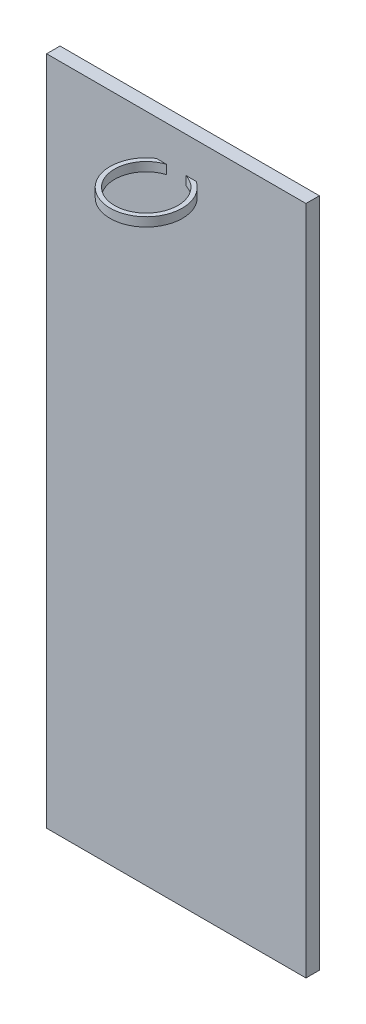
ISO-10303-21;
HEADER;
FILE_DESCRIPTION(('STEP AP214'),'2;1');
FILE_NAME('part.step','',(''),(''),'','','');
FILE_SCHEMA(('AUTOMOTIVE_DESIGN { 1 0 10303 214 1 1 1 1 }'));
ENDSEC;
DATA;
#1=APPLICATION_CONTEXT('core data for automotive mechanical design processes');
#2=APPLICATION_PROTOCOL_DEFINITION('international standard','automotive_design',2000,#1);
#3=PRODUCT_CONTEXT('',#1,'mechanical');
#4=PRODUCT('Part','Part','',(#3));
#5=PRODUCT_RELATED_PRODUCT_CATEGORY('part','',(#4));
#6=PRODUCT_DEFINITION_FORMATION('','',#4);
#7=PRODUCT_DEFINITION_CONTEXT('part definition',#1,'design');
#8=PRODUCT_DEFINITION('design','',#6,#7);
#9=PRODUCT_DEFINITION_SHAPE('','',#8);
#10=(LENGTH_UNIT() NAMED_UNIT(*) SI_UNIT(.MILLI.,.METRE.));
#11=(NAMED_UNIT(*) PLANE_ANGLE_UNIT() SI_UNIT($,.RADIAN.));
#12=(NAMED_UNIT(*) SI_UNIT($,.STERADIAN.) SOLID_ANGLE_UNIT());
#13=UNCERTAINTY_MEASURE_WITH_UNIT(LENGTH_MEASURE(1.E-05),#10,'distance_accuracy_value','');
#14=(GEOMETRIC_REPRESENTATION_CONTEXT(3) GLOBAL_UNCERTAINTY_ASSIGNED_CONTEXT((#13)) GLOBAL_UNIT_ASSIGNED_CONTEXT((#10,
#11,#12)) REPRESENTATION_CONTEXT('',''));
#15=CARTESIAN_POINT('',(0.,0.,0.));
#16=DIRECTION('',(0.,0.,1.));
#17=DIRECTION('',(1.,0.,0.));
#18=AXIS2_PLACEMENT_3D('',#15,#16,#17);
#19=CARTESIAN_POINT('',(0.,0.,3.));
#20=DIRECTION('',(0.,0.,1.));
#21=DIRECTION('',(1.,0.,0.));
#22=AXIS2_PLACEMENT_3D('',#19,#20,#21);
#23=PLANE('',#22);
#24=DIRECTION('',(0.,-1.,0.));
#25=VECTOR('',#24,1.);
#26=CARTESIAN_POINT('',(52.9772072708686,89.7731299513364,3.));
#27=LINE('',#26,#25);
#28=CARTESIAN_POINT('',(52.9772072708686,89.7731299513364,3.));
#29=VERTEX_POINT('',#28);
#30=CARTESIAN_POINT('',(52.9772072708686,-60.2268700486636,3.));
#31=VERTEX_POINT('',#30);
#32=EDGE_CURVE('E129',#29,#31,#27,.T.);
#33=ORIENTED_EDGE('',*,*,#32,.T.);
#34=DIRECTION('',(1.,0.,0.));
#35=VECTOR('',#34,1.);
#36=CARTESIAN_POINT('',(52.9772072708686,-60.2268700486636,3.));
#37=LINE('',#36,#35);
#38=CARTESIAN_POINT('',(110.977207270869,-60.2268700486636,3.));
#39=VERTEX_POINT('',#38);
#40=EDGE_CURVE('E132',#31,#39,#37,.T.);
#41=ORIENTED_EDGE('',*,*,#40,.T.);
#42=DIRECTION('',(0.,1.,0.));
#43=VECTOR('',#42,1.);
#44=CARTESIAN_POINT('',(110.977207270869,89.7731299513364,3.));
#45=LINE('',#44,#43);
#46=CARTESIAN_POINT('',(110.977207270869,89.7731299513364,3.));
#47=VERTEX_POINT('',#46);
#48=EDGE_CURVE('E135',#39,#47,#45,.T.);
#49=ORIENTED_EDGE('',*,*,#48,.T.);
#50=DIRECTION('',(-1.,0.,0.));
#51=VECTOR('',#50,1.);
#52=CARTESIAN_POINT('',(52.9772072708686,89.7731299513364,3.));
#53=LINE('',#52,#51);
#54=EDGE_CURVE('E137',#47,#29,#53,.T.);
#55=ORIENTED_EDGE('',*,*,#54,.T.);
#56=EDGE_LOOP('',(#33,#41,#49,#55));
#57=FACE_BOUND('',#56,.T.);
#58=DIRECTION('',(-1.,0.,0.));
#59=VECTOR('',#58,1.);
#60=CARTESIAN_POINT('',(0.,81.7731299513364,3.));
#61=LINE('',#60,#59);
#62=CARTESIAN_POINT('',(86.4500854010826,81.7731299513364,3.));
#63=VERTEX_POINT('',#62);
#64=CARTESIAN_POINT('',(84.180444618464,81.7731299513364,3.));
#65=VERTEX_POINT('',#64);
#66=EDGE_CURVE('E108',#63,#65,#61,.T.);
#67=ORIENTED_EDGE('',*,*,#66,.F.);
#68=DIRECTION('',(0.,-1.,0.));
#69=VECTOR('',#68,1.);
#70=CARTESIAN_POINT('',(86.4500854010826,81.7731299513364,3.));
#71=LINE('',#70,#69);
#72=CARTESIAN_POINT('',(86.4500854010826,79.7731299513364,3.));
#73=VERTEX_POINT('',#72);
#74=EDGE_CURVE('E117',#63,#73,#71,.T.);
#75=ORIENTED_EDGE('',*,*,#74,.T.);
#76=DIRECTION('',(-1.,0.,0.));
#77=VECTOR('',#76,1.);
#78=CARTESIAN_POINT('',(0.,79.7731299513364,3.));
#79=LINE('',#78,#77);
#80=CARTESIAN_POINT('',(84.180444618464,79.7731299513364,3.));
#81=VERTEX_POINT('',#80);
#82=EDGE_CURVE('E160',#73,#81,#79,.T.);
#83=ORIENTED_EDGE('',*,*,#82,.T.);
#84=DIRECTION('',(0.,-1.,0.));
#85=VECTOR('',#84,1.);
#86=CARTESIAN_POINT('',(84.180444618464,81.7731299513364,3.));
#87=LINE('',#86,#85);
#88=EDGE_CURVE('E158',#65,#81,#87,.T.);
#89=ORIENTED_EDGE('',*,*,#88,.F.);
#90=EDGE_LOOP('',(#67,#75,#83,#89));
#91=FACE_BOUND('',#90,.T.);
#92=CARTESIAN_POINT('',(79.7739699232732,79.7731299513364,3.));
#93=VERTEX_POINT('',#92);
#94=CARTESIAN_POINT('',(77.5043291406546,79.7731299513364,3.));
#95=VERTEX_POINT('',#94);
#96=EDGE_CURVE('E61',#93,#95,#79,.T.);
#97=ORIENTED_EDGE('',*,*,#96,.T.);
#98=DIRECTION('',(0.,-1.,0.));
#99=VECTOR('',#98,1.);
#100=CARTESIAN_POINT('',(77.5043291406546,81.7731299513364,3.));
#101=LINE('',#100,#99);
#102=CARTESIAN_POINT('',(77.5043291406546,81.7731299513364,3.));
#103=VERTEX_POINT('',#102);
#104=EDGE_CURVE('E12',#95,#103,#101,.F.);
#105=ORIENTED_EDGE('',*,*,#104,.T.);
#106=CARTESIAN_POINT('',(79.7739699232732,81.7731299513364,3.));
#107=VERTEX_POINT('',#106);
#108=EDGE_CURVE('E51',#107,#103,#61,.T.);
#109=ORIENTED_EDGE('',*,*,#108,.F.);
#110=DIRECTION('',(0.,-1.,0.));
#111=VECTOR('',#110,1.);
#112=CARTESIAN_POINT('',(79.7739699232732,81.7731299513364,3.));
#113=LINE('',#112,#111);
#114=EDGE_CURVE('E102',#93,#107,#113,.F.);
#115=ORIENTED_EDGE('',*,*,#114,.F.);
#116=EDGE_LOOP('',(#97,#105,#109,#115));
#117=FACE_BOUND('',#116,.T.);
#118=ADVANCED_FACE('F43',(#57,#91,#117),#23,.T.);
#119=CARTESIAN_POINT('',(52.9772072708686,89.7731299513364,3.));
#120=DIRECTION('',(1.,0.,0.));
#121=DIRECTION('',(0.,0.,-1.));
#122=AXIS2_PLACEMENT_3D('',#119,#120,#121);
#123=PLANE('',#122);
#124=DIRECTION('',(0.,-1.,0.));
#125=VECTOR('',#124,1.);
#126=CARTESIAN_POINT('',(52.9772072708686,89.7731299513364,0.));
#127=LINE('',#126,#125);
#128=CARTESIAN_POINT('',(52.9772072708686,89.7731299513364,0.));
#129=VERTEX_POINT('',#128);
#130=CARTESIAN_POINT('',(52.9772072708686,-60.2268700486636,0.));
#131=VERTEX_POINT('',#130);
#132=EDGE_CURVE('E127',#129,#131,#127,.T.);
#133=ORIENTED_EDGE('',*,*,#132,.T.);
#134=DIRECTION('',(0.,0.,-1.));
#135=VECTOR('',#134,1.);
#136=CARTESIAN_POINT('',(52.9772072708686,-60.2268700486636,3.));
#137=LINE('',#136,#135);
#138=EDGE_CURVE('E155',#31,#131,#137,.T.);
#139=ORIENTED_EDGE('',*,*,#138,.F.);
#140=ORIENTED_EDGE('',*,*,#32,.F.);
#141=DIRECTION('',(0.,0.,-1.));
#142=VECTOR('',#141,1.);
#143=CARTESIAN_POINT('',(52.9772072708686,89.7731299513364,3.));
#144=LINE('',#143,#142);
#145=EDGE_CURVE('E139',#29,#129,#144,.T.);
#146=ORIENTED_EDGE('',*,*,#145,.T.);
#147=EDGE_LOOP('',(#133,#139,#140,#146));
#148=FACE_BOUND('',#147,.T.);
#149=ADVANCED_FACE('F45',(#148),#123,.F.);
#150=CARTESIAN_POINT('',(52.9772072708686,-60.2268700486636,3.));
#151=DIRECTION('',(0.,1.,0.));
#152=DIRECTION('',(0.,0.,1.));
#153=AXIS2_PLACEMENT_3D('',#150,#151,#152);
#154=PLANE('',#153);
#155=DIRECTION('',(1.,0.,0.));
#156=VECTOR('',#155,1.);
#157=CARTESIAN_POINT('',(52.9772072708686,-60.2268700486636,0.));
#158=LINE('',#157,#156);
#159=CARTESIAN_POINT('',(110.977207270869,-60.2268700486636,0.));
#160=VERTEX_POINT('',#159);
#161=EDGE_CURVE('E142',#131,#160,#158,.T.);
#162=ORIENTED_EDGE('',*,*,#161,.T.);
#163=DIRECTION('',(0.,0.,-1.));
#164=VECTOR('',#163,1.);
#165=CARTESIAN_POINT('',(110.977207270869,-60.2268700486636,3.));
#166=LINE('',#165,#164);
#167=EDGE_CURVE('E152',#39,#160,#166,.T.);
#168=ORIENTED_EDGE('',*,*,#167,.F.);
#169=ORIENTED_EDGE('',*,*,#40,.F.);
#170=ORIENTED_EDGE('',*,*,#138,.T.);
#171=EDGE_LOOP('',(#162,#168,#169,#170));
#172=FACE_BOUND('',#171,.T.);
#173=ADVANCED_FACE('F186',(#172),#154,.F.);
#174=CARTESIAN_POINT('',(110.977207270869,89.7731299513364,3.));
#175=DIRECTION('',(-1.,0.,0.));
#176=DIRECTION('',(0.,0.,1.));
#177=AXIS2_PLACEMENT_3D('',#174,#175,#176);
#178=PLANE('',#177);
#179=DIRECTION('',(0.,1.,0.));
#180=VECTOR('',#179,1.);
#181=CARTESIAN_POINT('',(110.977207270869,89.7731299513364,0.));
#182=LINE('',#181,#180);
#183=CARTESIAN_POINT('',(110.977207270869,89.7731299513364,0.));
#184=VERTEX_POINT('',#183);
#185=EDGE_CURVE('E144',#160,#184,#182,.T.);
#186=ORIENTED_EDGE('',*,*,#185,.T.);
#187=DIRECTION('',(0.,0.,-1.));
#188=VECTOR('',#187,1.);
#189=CARTESIAN_POINT('',(110.977207270869,89.7731299513364,3.));
#190=LINE('',#189,#188);
#191=EDGE_CURVE('E149',#47,#184,#190,.T.);
#192=ORIENTED_EDGE('',*,*,#191,.F.);
#193=ORIENTED_EDGE('',*,*,#48,.F.);
#194=ORIENTED_EDGE('',*,*,#167,.T.);
#195=EDGE_LOOP('',(#186,#192,#193,#194));
#196=FACE_BOUND('',#195,.T.);
#197=ADVANCED_FACE('F196',(#196),#178,.F.);
#198=CARTESIAN_POINT('',(52.9772072708686,89.7731299513364,3.));
#199=DIRECTION('',(0.,-1.,0.));
#200=DIRECTION('',(0.,0.,-1.));
#201=AXIS2_PLACEMENT_3D('',#198,#199,#200);
#202=PLANE('',#201);
#203=DIRECTION('',(-1.,0.,0.));
#204=VECTOR('',#203,1.);
#205=CARTESIAN_POINT('',(52.9772072708686,89.7731299513364,0.));
#206=LINE('',#205,#204);
#207=EDGE_CURVE('E133',#184,#129,#206,.T.);
#208=ORIENTED_EDGE('',*,*,#207,.T.);
#209=ORIENTED_EDGE('',*,*,#145,.F.);
#210=ORIENTED_EDGE('',*,*,#54,.F.);
#211=ORIENTED_EDGE('',*,*,#191,.T.);
#212=EDGE_LOOP('',(#208,#209,#210,#211));
#213=FACE_BOUND('',#212,.T.);
#214=ADVANCED_FACE('F192',(#213),#202,.F.);
#215=CARTESIAN_POINT('',(0.,0.,0.));
#216=DIRECTION('',(0.,0.,1.));
#217=DIRECTION('',(1.,0.,0.));
#218=AXIS2_PLACEMENT_3D('',#215,#216,#217);
#219=PLANE('',#218);
#220=ORIENTED_EDGE('',*,*,#132,.F.);
#221=ORIENTED_EDGE('',*,*,#207,.F.);
#222=ORIENTED_EDGE('',*,*,#185,.F.);
#223=ORIENTED_EDGE('',*,*,#161,.F.);
#224=EDGE_LOOP('',(#220,#221,#222,#223));
#225=FACE_BOUND('',#224,.T.);
#226=ADVANCED_FACE('F189',(#225),#219,.F.);
#227=CARTESIAN_POINT('',(81.9772072708686,81.7731299513364,9.72445076665528));
#228=DIRECTION('',(0.,1.,0.));
#229=DIRECTION('',(0.,0.,1.));
#230=AXIS2_PLACEMENT_3D('',#227,#228,#229);
#231=PLANE('',#230);
#232=CARTESIAN_POINT('',(81.9772072708686,81.7731299513364,9.72445076665528));
#233=DIRECTION('',(0.,1.,0.));
#234=DIRECTION('',(1.,0.,0.));
#235=AXIS2_PLACEMENT_3D('',#232,#233,#234);
#236=CIRCLE('',#235,8.0761919789538);
#237=EDGE_CURVE('E123',#103,#63,#236,.T.);
#238=ORIENTED_EDGE('',*,*,#237,.T.);
#239=ORIENTED_EDGE('',*,*,#66,.T.);
#240=CARTESIAN_POINT('',(81.9772072708686,81.7731299513364,9.72445076665528));
#241=DIRECTION('',(0.,1.,0.));
#242=DIRECTION('',(0.,0.,1.));
#243=AXIS2_PLACEMENT_3D('',#240,#241,#242);
#244=CIRCLE('',#243,7.0761919789538);
#245=EDGE_CURVE('E114',#107,#65,#244,.T.);
#246=ORIENTED_EDGE('',*,*,#245,.F.);
#247=ORIENTED_EDGE('',*,*,#108,.T.);
#248=EDGE_LOOP('',(#238,#239,#246,#247));
#249=FACE_BOUND('',#248,.T.);
#250=ADVANCED_FACE('F119',(#249),#231,.T.);
#251=CARTESIAN_POINT('',(81.9772072708686,79.7731299513364,9.72445076665528));
#252=DIRECTION('',(0.,1.,0.));
#253=DIRECTION('',(0.,0.,1.));
#254=AXIS2_PLACEMENT_3D('',#251,#252,#253);
#255=PLANE('',#254);
#256=ORIENTED_EDGE('',*,*,#82,.F.);
#257=CARTESIAN_POINT('',(81.9772072708686,79.7731299513364,9.72445076665528));
#258=DIRECTION('',(0.,1.,0.));
#259=DIRECTION('',(1.,0.,0.));
#260=AXIS2_PLACEMENT_3D('',#257,#258,#259);
#261=CIRCLE('',#260,8.0761919789538);
#262=EDGE_CURVE('E120',#95,#73,#261,.T.);
#263=ORIENTED_EDGE('',*,*,#262,.F.);
#264=ORIENTED_EDGE('',*,*,#96,.F.);
#265=CARTESIAN_POINT('',(81.9772072708686,79.7731299513364,9.72445076665528));
#266=DIRECTION('',(0.,1.,0.));
#267=DIRECTION('',(0.,0.,1.));
#268=AXIS2_PLACEMENT_3D('',#265,#266,#267);
#269=CIRCLE('',#268,7.0761919789538);
#270=EDGE_CURVE('E116',#93,#81,#269,.T.);
#271=ORIENTED_EDGE('',*,*,#270,.T.);
#272=EDGE_LOOP('',(#256,#263,#264,#271));
#273=FACE_BOUND('',#272,.T.);
#274=ADVANCED_FACE('F168',(#273),#255,.F.);
#275=CARTESIAN_POINT('',(81.9772072708686,81.7731299513364,9.72445076665528));
#276=DIRECTION('',(0.,-1.,0.));
#277=DIRECTION('',(0.,0.,-1.));
#278=AXIS2_PLACEMENT_3D('',#275,#276,#277);
#279=CYLINDRICAL_SURFACE('',#278,8.0761919789538);
#280=ORIENTED_EDGE('',*,*,#104,.F.);
#281=ORIENTED_EDGE('',*,*,#262,.T.);
#282=ORIENTED_EDGE('',*,*,#74,.F.);
#283=ORIENTED_EDGE('',*,*,#237,.F.);
#284=EDGE_LOOP('',(#280,#281,#282,#283));
#285=FACE_BOUND('',#284,.T.);
#286=ADVANCED_FACE('F169',(#285),#279,.T.);
#287=CARTESIAN_POINT('',(81.9772072708686,81.7731299513364,9.72445076665528));
#288=DIRECTION('',(0.,-1.,0.));
#289=DIRECTION('',(0.,0.,-1.));
#290=AXIS2_PLACEMENT_3D('',#287,#288,#289);
#291=CYLINDRICAL_SURFACE('',#290,7.0761919789538);
#292=ORIENTED_EDGE('',*,*,#270,.F.);
#293=ORIENTED_EDGE('',*,*,#114,.T.);
#294=ORIENTED_EDGE('',*,*,#245,.T.);
#295=ORIENTED_EDGE('',*,*,#88,.T.);
#296=EDGE_LOOP('',(#292,#293,#294,#295));
#297=FACE_BOUND('',#296,.T.);
#298=ADVANCED_FACE('F112',(#297),#291,.F.);
#299=CLOSED_SHELL('',(#118,#149,#173,#197,#214,#226,#250,#274,#286,#298));
#300=MANIFOLD_SOLID_BREP('B2',#299);
#301=ADVANCED_BREP_SHAPE_REPRESENTATION('',(#18,#300),#14);
#302=SHAPE_DEFINITION_REPRESENTATION(#9,#301);
ENDSEC;
END-ISO-10303-21;
